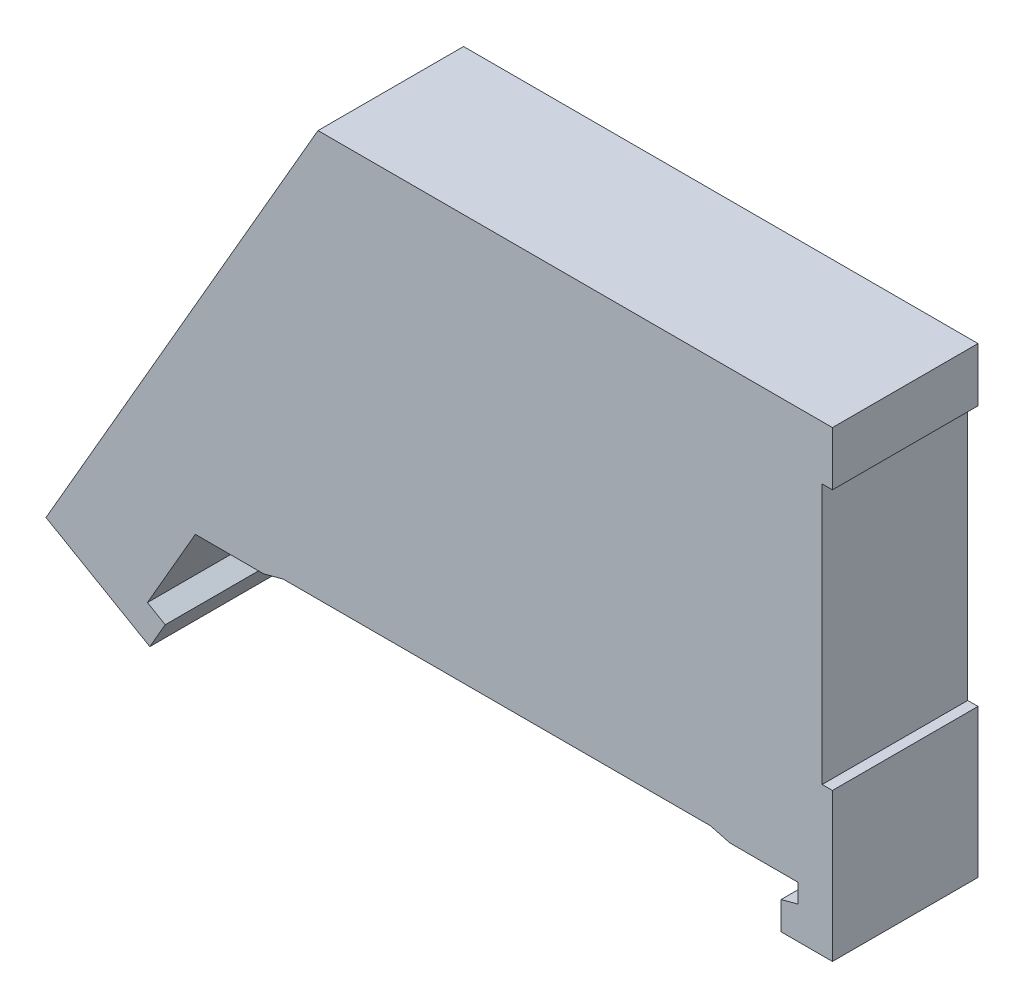
ISO-10303-21;
HEADER;
FILE_DESCRIPTION(('STEP AP214'),'2;1');
FILE_NAME('part.step','',(''),(''),'','','');
FILE_SCHEMA(('AUTOMOTIVE_DESIGN { 1 0 10303 214 1 1 1 1 }'));
ENDSEC;
DATA;
#1=APPLICATION_CONTEXT('core data for automotive mechanical design processes');
#2=APPLICATION_PROTOCOL_DEFINITION('international standard','automotive_design',2000,#1);
#3=PRODUCT_CONTEXT('',#1,'mechanical');
#4=PRODUCT('Part','Part','',(#3));
#5=PRODUCT_RELATED_PRODUCT_CATEGORY('part','',(#4));
#6=PRODUCT_DEFINITION_FORMATION('','',#4);
#7=PRODUCT_DEFINITION_CONTEXT('part definition',#1,'design');
#8=PRODUCT_DEFINITION('design','',#6,#7);
#9=PRODUCT_DEFINITION_SHAPE('','',#8);
#10=(LENGTH_UNIT() NAMED_UNIT(*) SI_UNIT(.MILLI.,.METRE.));
#11=(NAMED_UNIT(*) PLANE_ANGLE_UNIT() SI_UNIT($,.RADIAN.));
#12=(NAMED_UNIT(*) SI_UNIT($,.STERADIAN.) SOLID_ANGLE_UNIT());
#13=UNCERTAINTY_MEASURE_WITH_UNIT(LENGTH_MEASURE(1.E-05),#10,'distance_accuracy_value','');
#14=(GEOMETRIC_REPRESENTATION_CONTEXT(3) GLOBAL_UNCERTAINTY_ASSIGNED_CONTEXT((#13)) GLOBAL_UNIT_ASSIGNED_CONTEXT((#10,
#11,#12)) REPRESENTATION_CONTEXT('',''));
#15=CARTESIAN_POINT('',(0.,0.,0.));
#16=DIRECTION('',(0.,0.,1.));
#17=DIRECTION('',(1.,0.,0.));
#18=AXIS2_PLACEMENT_3D('',#15,#16,#17);
#19=CARTESIAN_POINT('',(9.19999999999996,0.,8.5));
#20=DIRECTION('',(-0.258819045102745,-0.965925826289008,0.));
#21=DIRECTION('',(0.965925826289008,-0.258819045102745,0.));
#22=AXIS2_PLACEMENT_3D('',#19,#20,#21);
#23=PLANE('',#22);
#24=DIRECTION('',(-0.965925826289008,0.258819045102745,0.));
#25=VECTOR('',#24,1.);
#26=CARTESIAN_POINT('',(9.19999999999996,0.,0.));
#27=LINE('',#26,#25);
#28=CARTESIAN_POINT('',(9.19999999999996,0.,0.));
#29=VERTEX_POINT('',#28);
#30=CARTESIAN_POINT('',(8.08038475772999,0.300000000000001,0.));
#31=VERTEX_POINT('',#30);
#32=EDGE_CURVE('E201',#29,#31,#27,.T.);
#33=ORIENTED_EDGE('',*,*,#32,.F.);
#34=DIRECTION('',(0.,0.,-1.));
#35=VECTOR('',#34,1.);
#36=CARTESIAN_POINT('',(9.19999999999996,0.,8.5));
#37=LINE('',#36,#35);
#38=CARTESIAN_POINT('',(9.19999999999996,0.,8.5));
#39=VERTEX_POINT('',#38);
#40=EDGE_CURVE('E11',#39,#29,#37,.T.);
#41=ORIENTED_EDGE('',*,*,#40,.F.);
#42=DIRECTION('',(-0.965925826289008,0.258819045102745,0.));
#43=VECTOR('',#42,1.);
#44=CARTESIAN_POINT('',(9.19999999999996,0.,8.5));
#45=LINE('',#44,#43);
#46=CARTESIAN_POINT('',(8.08038475772999,0.300000000000001,8.5));
#47=VERTEX_POINT('',#46);
#48=EDGE_CURVE('E257',#39,#47,#45,.T.);
#49=ORIENTED_EDGE('',*,*,#48,.T.);
#50=DIRECTION('',(0.,0.,-1.));
#51=VECTOR('',#50,1.);
#52=CARTESIAN_POINT('',(8.08038475772999,0.300000000000001,8.5));
#53=LINE('',#52,#51);
#54=EDGE_CURVE('E35',#47,#31,#53,.T.);
#55=ORIENTED_EDGE('',*,*,#54,.T.);
#56=EDGE_LOOP('',(#33,#41,#49,#55));
#57=FACE_BOUND('',#56,.T.);
#58=ADVANCED_FACE('F32',(#57),#23,.T.);
#59=CARTESIAN_POINT('',(13.2,0.,8.5));
#60=DIRECTION('',(0.,-1.,0.));
#61=DIRECTION('',(1.,0.,0.));
#62=AXIS2_PLACEMENT_3D('',#59,#60,#61);
#63=PLANE('',#62);
#64=DIRECTION('',(-1.,0.,0.));
#65=VECTOR('',#64,1.);
#66=CARTESIAN_POINT('',(13.2,0.,0.));
#67=LINE('',#66,#65);
#68=CARTESIAN_POINT('',(13.2,0.,0.));
#69=VERTEX_POINT('',#68);
#70=EDGE_CURVE('E255',#69,#29,#67,.T.);
#71=ORIENTED_EDGE('',*,*,#70,.F.);
#72=DIRECTION('',(0.,0.,-1.));
#73=VECTOR('',#72,1.);
#74=CARTESIAN_POINT('',(13.2,0.,8.5));
#75=LINE('',#74,#73);
#76=CARTESIAN_POINT('',(13.2,0.,8.5));
#77=VERTEX_POINT('',#76);
#78=EDGE_CURVE('E41',#77,#69,#75,.T.);
#79=ORIENTED_EDGE('',*,*,#78,.F.);
#80=DIRECTION('',(-1.,0.,0.));
#81=VECTOR('',#80,1.);
#82=CARTESIAN_POINT('',(13.2,0.,8.5));
#83=LINE('',#82,#81);
#84=EDGE_CURVE('E191',#77,#39,#83,.T.);
#85=ORIENTED_EDGE('',*,*,#84,.T.);
#86=ORIENTED_EDGE('',*,*,#40,.T.);
#87=EDGE_LOOP('',(#71,#79,#85,#86));
#88=FACE_BOUND('',#87,.T.);
#89=ADVANCED_FACE('F293',(#88),#63,.T.);
#90=CARTESIAN_POINT('',(13.1999999999998,-1.09999999999924,8.5));
#91=DIRECTION('',(-1.,1.86088518332187E-13,0.));
#92=DIRECTION('',(-1.86088518332187E-13,-1.,0.));
#93=AXIS2_PLACEMENT_3D('',#90,#91,#92);
#94=PLANE('',#93);
#95=DIRECTION('',(1.86088518332187E-13,1.,0.));
#96=VECTOR('',#95,1.);
#97=CARTESIAN_POINT('',(13.1999999999998,-1.09999999999924,0.));
#98=LINE('',#97,#96);
#99=CARTESIAN_POINT('',(13.1999999999998,-1.09999999999924,0.));
#100=VERTEX_POINT('',#99);
#101=EDGE_CURVE('E178',#100,#69,#98,.T.);
#102=ORIENTED_EDGE('',*,*,#101,.F.);
#103=DIRECTION('',(0.,0.,-1.));
#104=VECTOR('',#103,1.);
#105=CARTESIAN_POINT('',(13.1999999999998,-1.09999999999924,8.5));
#106=LINE('',#105,#104);
#107=CARTESIAN_POINT('',(13.1999999999998,-1.09999999999924,8.5));
#108=VERTEX_POINT('',#107);
#109=EDGE_CURVE('E173',#108,#100,#106,.T.);
#110=ORIENTED_EDGE('',*,*,#109,.F.);
#111=DIRECTION('',(1.86088518332187E-13,1.,0.));
#112=VECTOR('',#111,1.);
#113=CARTESIAN_POINT('',(13.1999999999998,-1.09999999999924,8.5));
#114=LINE('',#113,#112);
#115=EDGE_CURVE('E176',#108,#77,#114,.T.);
#116=ORIENTED_EDGE('',*,*,#115,.T.);
#117=ORIENTED_EDGE('',*,*,#78,.T.);
#118=EDGE_LOOP('',(#102,#110,#116,#117));
#119=FACE_BOUND('',#118,.T.);
#120=ADVANCED_FACE('F175',(#119),#94,.T.);
#121=CARTESIAN_POINT('',(12.2,-1.36794919243,8.5));
#122=DIRECTION('',(-0.258819045102247,0.965925826289142,0.));
#123=DIRECTION('',(-0.965925826289142,-0.258819045102247,0.));
#124=AXIS2_PLACEMENT_3D('',#121,#122,#123);
#125=PLANE('',#124);
#126=DIRECTION('',(0.965925826289142,0.258819045102247,0.));
#127=VECTOR('',#126,1.);
#128=CARTESIAN_POINT('',(12.2,-1.36794919243,0.));
#129=LINE('',#128,#127);
#130=CARTESIAN_POINT('',(12.2,-1.36794919243,0.));
#131=VERTEX_POINT('',#130);
#132=EDGE_CURVE('E252',#131,#100,#129,.T.);
#133=ORIENTED_EDGE('',*,*,#132,.F.);
#134=DIRECTION('',(0.,0.,-1.));
#135=VECTOR('',#134,1.);
#136=CARTESIAN_POINT('',(12.2,-1.36794919243,8.5));
#137=LINE('',#136,#135);
#138=CARTESIAN_POINT('',(12.2,-1.36794919243,8.5));
#139=VERTEX_POINT('',#138);
#140=EDGE_CURVE('E183',#139,#131,#137,.T.);
#141=ORIENTED_EDGE('',*,*,#140,.F.);
#142=DIRECTION('',(0.965925826289142,0.258819045102247,0.));
#143=VECTOR('',#142,1.);
#144=CARTESIAN_POINT('',(12.2,-1.36794919243,8.5));
#145=LINE('',#144,#143);
#146=EDGE_CURVE('E189',#139,#108,#145,.T.);
#147=ORIENTED_EDGE('',*,*,#146,.T.);
#148=ORIENTED_EDGE('',*,*,#109,.T.);
#149=EDGE_LOOP('',(#133,#141,#147,#148));
#150=FACE_BOUND('',#149,.T.);
#151=ADVANCED_FACE('F193',(#150),#125,.T.);
#152=CARTESIAN_POINT('',(12.2,-3.,8.5));
#153=DIRECTION('',(-1.,0.,0.));
#154=DIRECTION('',(0.,0.,1.));
#155=AXIS2_PLACEMENT_3D('',#152,#153,#154);
#156=PLANE('',#155);
#157=DIRECTION('',(0.,1.,0.));
#158=VECTOR('',#157,1.);
#159=CARTESIAN_POINT('',(12.2,-3.,0.));
#160=LINE('',#159,#158);
#161=CARTESIAN_POINT('',(12.2,-3.,0.));
#162=VERTEX_POINT('',#161);
#163=EDGE_CURVE('E249',#162,#131,#160,.T.);
#164=ORIENTED_EDGE('',*,*,#163,.F.);
#165=DIRECTION('',(0.,0.,-1.));
#166=VECTOR('',#165,1.);
#167=CARTESIAN_POINT('',(12.2,-3.,8.5));
#168=LINE('',#167,#166);
#169=CARTESIAN_POINT('',(12.2,-3.,8.5));
#170=VERTEX_POINT('',#169);
#171=EDGE_CURVE('E261',#170,#162,#168,.T.);
#172=ORIENTED_EDGE('',*,*,#171,.F.);
#173=DIRECTION('',(0.,1.,0.));
#174=VECTOR('',#173,1.);
#175=CARTESIAN_POINT('',(12.2,-3.,8.5));
#176=LINE('',#175,#174);
#177=EDGE_CURVE('E194',#170,#139,#176,.T.);
#178=ORIENTED_EDGE('',*,*,#177,.T.);
#179=ORIENTED_EDGE('',*,*,#140,.T.);
#180=EDGE_LOOP('',(#164,#172,#178,#179));
#181=FACE_BOUND('',#180,.T.);
#182=ADVANCED_FACE('F306',(#181),#156,.T.);
#183=CARTESIAN_POINT('',(15.2,-3.,8.5));
#184=DIRECTION('',(0.,-1.,0.));
#185=DIRECTION('',(0.,0.,-1.));
#186=AXIS2_PLACEMENT_3D('',#183,#184,#185);
#187=PLANE('',#186);
#188=DIRECTION('',(-1.,0.,0.));
#189=VECTOR('',#188,1.);
#190=CARTESIAN_POINT('',(15.2,-3.,0.));
#191=LINE('',#190,#189);
#192=CARTESIAN_POINT('',(15.2,-3.,0.));
#193=VERTEX_POINT('',#192);
#194=EDGE_CURVE('E246',#193,#162,#191,.T.);
#195=ORIENTED_EDGE('',*,*,#194,.F.);
#196=DIRECTION('',(0.,0.,-1.));
#197=VECTOR('',#196,1.);
#198=CARTESIAN_POINT('',(15.2,-3.,8.5));
#199=LINE('',#198,#197);
#200=CARTESIAN_POINT('',(15.2,-3.,8.5));
#201=VERTEX_POINT('',#200);
#202=EDGE_CURVE('E263',#201,#193,#199,.T.);
#203=ORIENTED_EDGE('',*,*,#202,.F.);
#204=DIRECTION('',(-1.,0.,0.));
#205=VECTOR('',#204,1.);
#206=CARTESIAN_POINT('',(15.2,-3.,8.5));
#207=LINE('',#206,#205);
#208=EDGE_CURVE('E196',#201,#170,#207,.T.);
#209=ORIENTED_EDGE('',*,*,#208,.T.);
#210=ORIENTED_EDGE('',*,*,#171,.T.);
#211=EDGE_LOOP('',(#195,#203,#209,#210));
#212=FACE_BOUND('',#211,.T.);
#213=ADVANCED_FACE('F309',(#212),#187,.T.);
#214=CARTESIAN_POINT('',(15.2,5.65,8.5));
#215=DIRECTION('',(1.,0.,0.));
#216=DIRECTION('',(0.,0.,-1.));
#217=AXIS2_PLACEMENT_3D('',#214,#215,#216);
#218=PLANE('',#217);
#219=DIRECTION('',(0.,-1.,0.));
#220=VECTOR('',#219,1.);
#221=CARTESIAN_POINT('',(15.2,5.65,0.));
#222=LINE('',#221,#220);
#223=CARTESIAN_POINT('',(15.2,5.65,0.));
#224=VERTEX_POINT('',#223);
#225=EDGE_CURVE('E243',#224,#193,#222,.T.);
#226=ORIENTED_EDGE('',*,*,#225,.F.);
#227=DIRECTION('',(0.,0.,-1.));
#228=VECTOR('',#227,1.);
#229=CARTESIAN_POINT('',(15.2,5.65,8.5));
#230=LINE('',#229,#228);
#231=CARTESIAN_POINT('',(15.2,5.65,8.5));
#232=VERTEX_POINT('',#231);
#233=EDGE_CURVE('E265',#232,#224,#230,.T.);
#234=ORIENTED_EDGE('',*,*,#233,.F.);
#235=DIRECTION('',(0.,-1.,0.));
#236=VECTOR('',#235,1.);
#237=CARTESIAN_POINT('',(15.2,5.65,8.5));
#238=LINE('',#237,#236);
#239=EDGE_CURVE('E548',#232,#201,#238,.T.);
#240=ORIENTED_EDGE('',*,*,#239,.T.);
#241=ORIENTED_EDGE('',*,*,#202,.T.);
#242=EDGE_LOOP('',(#226,#234,#240,#241));
#243=FACE_BOUND('',#242,.T.);
#244=ADVANCED_FACE('F313',(#243),#218,.T.);
#245=CARTESIAN_POINT('',(14.6,5.65,8.5));
#246=DIRECTION('',(0.,1.,0.));
#247=DIRECTION('',(0.,0.,1.));
#248=AXIS2_PLACEMENT_3D('',#245,#246,#247);
#249=PLANE('',#248);
#250=DIRECTION('',(1.,0.,0.));
#251=VECTOR('',#250,1.);
#252=CARTESIAN_POINT('',(14.6,5.65,0.));
#253=LINE('',#252,#251);
#254=CARTESIAN_POINT('',(14.6,5.65,0.));
#255=VERTEX_POINT('',#254);
#256=EDGE_CURVE('E240',#255,#224,#253,.T.);
#257=ORIENTED_EDGE('',*,*,#256,.F.);
#258=DIRECTION('',(0.,0.,-1.));
#259=VECTOR('',#258,1.);
#260=CARTESIAN_POINT('',(14.6,5.65,8.5));
#261=LINE('',#260,#259);
#262=CARTESIAN_POINT('',(14.6,5.65,8.5));
#263=VERTEX_POINT('',#262);
#264=EDGE_CURVE('E267',#263,#255,#261,.T.);
#265=ORIENTED_EDGE('',*,*,#264,.F.);
#266=DIRECTION('',(1.,0.,0.));
#267=VECTOR('',#266,1.);
#268=CARTESIAN_POINT('',(14.6,5.65,8.5));
#269=LINE('',#268,#267);
#270=EDGE_CURVE('E541',#263,#232,#269,.T.);
#271=ORIENTED_EDGE('',*,*,#270,.T.);
#272=ORIENTED_EDGE('',*,*,#233,.T.);
#273=EDGE_LOOP('',(#257,#265,#271,#272));
#274=FACE_BOUND('',#273,.T.);
#275=ADVANCED_FACE('F317',(#274),#249,.T.);
#276=CARTESIAN_POINT('',(14.6,20.85,8.5));
#277=DIRECTION('',(1.,0.,0.));
#278=DIRECTION('',(0.,0.,-1.));
#279=AXIS2_PLACEMENT_3D('',#276,#277,#278);
#280=PLANE('',#279);
#281=DIRECTION('',(0.,-1.,0.));
#282=VECTOR('',#281,1.);
#283=CARTESIAN_POINT('',(14.6,20.85,0.));
#284=LINE('',#283,#282);
#285=CARTESIAN_POINT('',(14.6,20.85,0.));
#286=VERTEX_POINT('',#285);
#287=EDGE_CURVE('E237',#286,#255,#284,.T.);
#288=ORIENTED_EDGE('',*,*,#287,.F.);
#289=DIRECTION('',(0.,0.,-1.));
#290=VECTOR('',#289,1.);
#291=CARTESIAN_POINT('',(14.6,20.85,8.5));
#292=LINE('',#291,#290);
#293=CARTESIAN_POINT('',(14.6,20.85,8.5));
#294=VERTEX_POINT('',#293);
#295=EDGE_CURVE('E269',#294,#286,#292,.T.);
#296=ORIENTED_EDGE('',*,*,#295,.F.);
#297=DIRECTION('',(0.,-1.,0.));
#298=VECTOR('',#297,1.);
#299=CARTESIAN_POINT('',(14.6,20.85,8.5));
#300=LINE('',#299,#298);
#301=EDGE_CURVE('E537',#294,#263,#300,.T.);
#302=ORIENTED_EDGE('',*,*,#301,.T.);
#303=ORIENTED_EDGE('',*,*,#264,.T.);
#304=EDGE_LOOP('',(#288,#296,#302,#303));
#305=FACE_BOUND('',#304,.T.);
#306=ADVANCED_FACE('F321',(#305),#280,.T.);
#307=CARTESIAN_POINT('',(15.2,20.85,8.5));
#308=DIRECTION('',(0.,-1.,0.));
#309=DIRECTION('',(0.,0.,-1.));
#310=AXIS2_PLACEMENT_3D('',#307,#308,#309);
#311=PLANE('',#310);
#312=DIRECTION('',(-1.,0.,0.));
#313=VECTOR('',#312,1.);
#314=CARTESIAN_POINT('',(15.2,20.85,0.));
#315=LINE('',#314,#313);
#316=CARTESIAN_POINT('',(15.2,20.85,0.));
#317=VERTEX_POINT('',#316);
#318=EDGE_CURVE('E234',#317,#286,#315,.T.);
#319=ORIENTED_EDGE('',*,*,#318,.F.);
#320=DIRECTION('',(0.,0.,-1.));
#321=VECTOR('',#320,1.);
#322=CARTESIAN_POINT('',(15.2,20.85,8.5));
#323=LINE('',#322,#321);
#324=CARTESIAN_POINT('',(15.2,20.85,8.5));
#325=VERTEX_POINT('',#324);
#326=EDGE_CURVE('E271',#325,#317,#323,.T.);
#327=ORIENTED_EDGE('',*,*,#326,.F.);
#328=DIRECTION('',(-1.,0.,0.));
#329=VECTOR('',#328,1.);
#330=CARTESIAN_POINT('',(15.2,20.85,8.5));
#331=LINE('',#330,#329);
#332=EDGE_CURVE('E553',#325,#294,#331,.T.);
#333=ORIENTED_EDGE('',*,*,#332,.T.);
#334=ORIENTED_EDGE('',*,*,#295,.T.);
#335=EDGE_LOOP('',(#319,#327,#333,#334));
#336=FACE_BOUND('',#335,.T.);
#337=ADVANCED_FACE('F325',(#336),#311,.T.);
#338=CARTESIAN_POINT('',(15.2,24.,8.5));
#339=DIRECTION('',(1.,0.,0.));
#340=DIRECTION('',(0.,0.,-1.));
#341=AXIS2_PLACEMENT_3D('',#338,#339,#340);
#342=PLANE('',#341);
#343=DIRECTION('',(0.,-1.,0.));
#344=VECTOR('',#343,1.);
#345=CARTESIAN_POINT('',(15.2,24.,0.));
#346=LINE('',#345,#344);
#347=CARTESIAN_POINT('',(15.2,24.,0.));
#348=VERTEX_POINT('',#347);
#349=EDGE_CURVE('E231',#348,#317,#346,.T.);
#350=ORIENTED_EDGE('',*,*,#349,.F.);
#351=DIRECTION('',(0.,0.,-1.));
#352=VECTOR('',#351,1.);
#353=CARTESIAN_POINT('',(15.2,24.,8.5));
#354=LINE('',#353,#352);
#355=CARTESIAN_POINT('',(15.2,24.,8.5));
#356=VERTEX_POINT('',#355);
#357=EDGE_CURVE('E273',#356,#348,#354,.T.);
#358=ORIENTED_EDGE('',*,*,#357,.F.);
#359=DIRECTION('',(0.,-1.,0.));
#360=VECTOR('',#359,1.);
#361=CARTESIAN_POINT('',(15.2,24.,8.5));
#362=LINE('',#361,#360);
#363=EDGE_CURVE('E530',#356,#325,#362,.T.);
#364=ORIENTED_EDGE('',*,*,#363,.T.);
#365=ORIENTED_EDGE('',*,*,#326,.T.);
#366=EDGE_LOOP('',(#350,#358,#364,#365));
#367=FACE_BOUND('',#366,.T.);
#368=ADVANCED_FACE('F329',(#367),#342,.T.);
#369=CARTESIAN_POINT('',(-14.8397459621683,24.,8.5));
#370=DIRECTION('',(0.,1.,0.));
#371=DIRECTION('',(-1.,0.,0.));
#372=AXIS2_PLACEMENT_3D('',#369,#370,#371);
#373=PLANE('',#372);
#374=DIRECTION('',(1.,0.,0.));
#375=VECTOR('',#374,1.);
#376=CARTESIAN_POINT('',(-14.8397459621683,24.,0.));
#377=LINE('',#376,#375);
#378=CARTESIAN_POINT('',(-14.8397459621683,24.,0.));
#379=VERTEX_POINT('',#378);
#380=EDGE_CURVE('E228',#379,#348,#377,.T.);
#381=ORIENTED_EDGE('',*,*,#380,.F.);
#382=DIRECTION('',(0.,0.,-1.));
#383=VECTOR('',#382,1.);
#384=CARTESIAN_POINT('',(-14.8397459621683,24.,8.5));
#385=LINE('',#384,#383);
#386=CARTESIAN_POINT('',(-14.8397459621683,24.,8.5));
#387=VERTEX_POINT('',#386);
#388=EDGE_CURVE('E275',#387,#379,#385,.T.);
#389=ORIENTED_EDGE('',*,*,#388,.F.);
#390=DIRECTION('',(1.,0.,0.));
#391=VECTOR('',#390,1.);
#392=CARTESIAN_POINT('',(-14.8397459621683,24.,8.5));
#393=LINE('',#392,#391);
#394=EDGE_CURVE('E526',#387,#356,#393,.T.);
#395=ORIENTED_EDGE('',*,*,#394,.T.);
#396=ORIENTED_EDGE('',*,*,#357,.T.);
#397=EDGE_LOOP('',(#381,#389,#395,#396));
#398=FACE_BOUND('',#397,.T.);
#399=ADVANCED_FACE('F333',(#398),#373,.T.);
#400=CARTESIAN_POINT('',(-30.7221143170399,-3.50906893516158,8.5));
#401=DIRECTION('',(-0.866025403784438,0.500000000000001,0.));
#402=DIRECTION('',(-0.500000000000001,-0.866025403784438,0.));
#403=AXIS2_PLACEMENT_3D('',#400,#401,#402);
#404=PLANE('',#403);
#405=DIRECTION('',(0.500000000000001,0.866025403784438,0.));
#406=VECTOR('',#405,1.);
#407=CARTESIAN_POINT('',(-30.7221143170399,-3.50906893516158,0.));
#408=LINE('',#407,#406);
#409=CARTESIAN_POINT('',(-30.7221143170399,-3.50906893516158,0.));
#410=VERTEX_POINT('',#409);
#411=EDGE_CURVE('E225',#410,#379,#408,.T.);
#412=ORIENTED_EDGE('',*,*,#411,.F.);
#413=DIRECTION('',(0.,0.,-1.));
#414=VECTOR('',#413,1.);
#415=CARTESIAN_POINT('',(-30.7221143170399,-3.50906893516158,8.5));
#416=LINE('',#415,#414);
#417=CARTESIAN_POINT('',(-30.7221143170399,-3.50906893516158,8.5));
#418=VERTEX_POINT('',#417);
#419=EDGE_CURVE('E277',#418,#410,#416,.T.);
#420=ORIENTED_EDGE('',*,*,#419,.F.);
#421=DIRECTION('',(0.500000000000001,0.866025403784438,0.));
#422=VECTOR('',#421,1.);
#423=CARTESIAN_POINT('',(-30.7221143170399,-3.50906893516158,8.5));
#424=LINE('',#423,#422);
#425=EDGE_CURVE('E557',#418,#387,#424,.T.);
#426=ORIENTED_EDGE('',*,*,#425,.T.);
#427=ORIENTED_EDGE('',*,*,#388,.T.);
#428=EDGE_LOOP('',(#412,#420,#426,#427));
#429=FACE_BOUND('',#428,.T.);
#430=ADVANCED_FACE('F337',(#429),#404,.T.);
#431=CARTESIAN_POINT('',(-24.6599364905099,-7.00906893518406,8.5));
#432=DIRECTION('',(-0.5,-0.866025403784439,0.));
#433=DIRECTION('',(0.866025403784439,-0.5,0.));
#434=AXIS2_PLACEMENT_3D('',#431,#432,#433);
#435=PLANE('',#434);
#436=DIRECTION('',(-0.866025403784439,0.5,0.));
#437=VECTOR('',#436,1.);
#438=CARTESIAN_POINT('',(-24.6599364905099,-7.00906893518406,0.));
#439=LINE('',#438,#437);
#440=CARTESIAN_POINT('',(-24.6599364905099,-7.00906893518406,0.));
#441=VERTEX_POINT('',#440);
#442=EDGE_CURVE('E222',#441,#410,#439,.T.);
#443=ORIENTED_EDGE('',*,*,#442,.F.);
#444=DIRECTION('',(0.,0.,-1.));
#445=VECTOR('',#444,1.);
#446=CARTESIAN_POINT('',(-24.6599364905099,-7.00906893518406,8.5));
#447=LINE('',#446,#445);
#448=CARTESIAN_POINT('',(-24.6599364905099,-7.00906893518406,8.5));
#449=VERTEX_POINT('',#448);
#450=EDGE_CURVE('E279',#449,#441,#447,.T.);
#451=ORIENTED_EDGE('',*,*,#450,.F.);
#452=DIRECTION('',(-0.866025403784439,0.5,0.));
#453=VECTOR('',#452,1.);
#454=CARTESIAN_POINT('',(-24.6599364905099,-7.00906893518406,8.5));
#455=LINE('',#454,#453);
#456=EDGE_CURVE('E519',#449,#418,#455,.T.);
#457=ORIENTED_EDGE('',*,*,#456,.T.);
#458=ORIENTED_EDGE('',*,*,#419,.T.);
#459=EDGE_LOOP('',(#443,#451,#457,#458));
#460=FACE_BOUND('',#459,.T.);
#461=ADVANCED_FACE('F341',(#460),#435,.T.);
#462=CARTESIAN_POINT('',(-23.7599364905083,-5.45022320836935,8.5));
#463=DIRECTION('',(0.866025403784439,-0.5,0.));
#464=DIRECTION('',(0.5,0.866025403784439,0.));
#465=AXIS2_PLACEMENT_3D('',#462,#463,#464);
#466=PLANE('',#465);
#467=DIRECTION('',(-0.5,-0.866025403784439,0.));
#468=VECTOR('',#467,1.);
#469=CARTESIAN_POINT('',(-23.7599364905083,-5.45022320836935,0.));
#470=LINE('',#469,#468);
#471=CARTESIAN_POINT('',(-23.7599364905083,-5.45022320836935,0.));
#472=VERTEX_POINT('',#471);
#473=EDGE_CURVE('E219',#472,#441,#470,.T.);
#474=ORIENTED_EDGE('',*,*,#473,.F.);
#475=DIRECTION('',(0.,0.,-1.));
#476=VECTOR('',#475,1.);
#477=CARTESIAN_POINT('',(-23.7599364905083,-5.45022320836935,8.5));
#478=LINE('',#477,#476);
#479=CARTESIAN_POINT('',(-23.7599364905083,-5.45022320836935,8.5));
#480=VERTEX_POINT('',#479);
#481=EDGE_CURVE('E281',#480,#472,#478,.T.);
#482=ORIENTED_EDGE('',*,*,#481,.F.);
#483=DIRECTION('',(-0.5,-0.866025403784439,0.));
#484=VECTOR('',#483,1.);
#485=CARTESIAN_POINT('',(-23.7599364905083,-5.45022320836935,8.5));
#486=LINE('',#485,#484);
#487=EDGE_CURVE('E515',#480,#449,#486,.T.);
#488=ORIENTED_EDGE('',*,*,#487,.T.);
#489=ORIENTED_EDGE('',*,*,#450,.T.);
#490=EDGE_LOOP('',(#474,#482,#488,#489));
#491=FACE_BOUND('',#490,.T.);
#492=ADVANCED_FACE('F345',(#491),#466,.T.);
#493=CARTESIAN_POINT('',(-24.7999999999988,-4.8497422611907,8.5));
#494=DIRECTION('',(0.499999999999999,0.866025403784439,0.));
#495=DIRECTION('',(-0.866025403784439,0.499999999999999,0.));
#496=AXIS2_PLACEMENT_3D('',#493,#494,#495);
#497=PLANE('',#496);
#498=DIRECTION('',(0.866025403784439,-0.499999999999999,0.));
#499=VECTOR('',#498,1.);
#500=CARTESIAN_POINT('',(-24.7999999999988,-4.8497422611907,0.));
#501=LINE('',#500,#499);
#502=CARTESIAN_POINT('',(-24.7999999999988,-4.8497422611907,0.));
#503=VERTEX_POINT('',#502);
#504=EDGE_CURVE('E216',#503,#472,#501,.T.);
#505=ORIENTED_EDGE('',*,*,#504,.F.);
#506=DIRECTION('',(0.,0.,-1.));
#507=VECTOR('',#506,1.);
#508=CARTESIAN_POINT('',(-24.7999999999988,-4.8497422611907,8.5));
#509=LINE('',#508,#507);
#510=CARTESIAN_POINT('',(-24.7999999999988,-4.8497422611907,8.5));
#511=VERTEX_POINT('',#510);
#512=EDGE_CURVE('E283',#511,#503,#509,.T.);
#513=ORIENTED_EDGE('',*,*,#512,.F.);
#514=DIRECTION('',(0.866025403784439,-0.499999999999999,0.));
#515=VECTOR('',#514,1.);
#516=CARTESIAN_POINT('',(-24.7999999999988,-4.8497422611907,8.5));
#517=LINE('',#516,#515);
#518=EDGE_CURVE('E561',#511,#480,#517,.T.);
#519=ORIENTED_EDGE('',*,*,#518,.T.);
#520=ORIENTED_EDGE('',*,*,#481,.T.);
#521=EDGE_LOOP('',(#505,#513,#519,#520));
#522=FACE_BOUND('',#521,.T.);
#523=ADVANCED_FACE('F349',(#522),#497,.T.);
#524=CARTESIAN_POINT('',(-22.,0.,8.5));
#525=DIRECTION('',(0.86602540378444,-0.499999999999998,0.));
#526=DIRECTION('',(0.499999999999998,0.86602540378444,0.));
#527=AXIS2_PLACEMENT_3D('',#524,#525,#526);
#528=PLANE('',#527);
#529=DIRECTION('',(-0.499999999999998,-0.86602540378444,0.));
#530=VECTOR('',#529,1.);
#531=CARTESIAN_POINT('',(-22.,0.,0.));
#532=LINE('',#531,#530);
#533=CARTESIAN_POINT('',(-22.,0.,0.));
#534=VERTEX_POINT('',#533);
#535=EDGE_CURVE('E213',#534,#503,#532,.T.);
#536=ORIENTED_EDGE('',*,*,#535,.F.);
#537=DIRECTION('',(0.,0.,-1.));
#538=VECTOR('',#537,1.);
#539=CARTESIAN_POINT('',(-22.,0.,8.5));
#540=LINE('',#539,#538);
#541=CARTESIAN_POINT('',(-22.,0.,8.5));
#542=VERTEX_POINT('',#541);
#543=EDGE_CURVE('E285',#542,#534,#540,.T.);
#544=ORIENTED_EDGE('',*,*,#543,.F.);
#545=DIRECTION('',(-0.499999999999998,-0.86602540378444,0.));
#546=VECTOR('',#545,1.);
#547=CARTESIAN_POINT('',(-22.,0.,8.5));
#548=LINE('',#547,#546);
#549=EDGE_CURVE('E508',#542,#511,#548,.T.);
#550=ORIENTED_EDGE('',*,*,#549,.T.);
#551=ORIENTED_EDGE('',*,*,#512,.T.);
#552=EDGE_LOOP('',(#536,#544,#550,#551));
#553=FACE_BOUND('',#552,.T.);
#554=ADVANCED_FACE('F353',(#553),#528,.T.);
#555=CARTESIAN_POINT('',(-18.,0.,8.5));
#556=DIRECTION('',(0.,-1.,0.));
#557=DIRECTION('',(1.,0.,0.));
#558=AXIS2_PLACEMENT_3D('',#555,#556,#557);
#559=PLANE('',#558);
#560=DIRECTION('',(-1.,0.,0.));
#561=VECTOR('',#560,1.);
#562=CARTESIAN_POINT('',(-18.,0.,0.));
#563=LINE('',#562,#561);
#564=CARTESIAN_POINT('',(-18.,0.,0.));
#565=VERTEX_POINT('',#564);
#566=EDGE_CURVE('E210',#565,#534,#563,.T.);
#567=ORIENTED_EDGE('',*,*,#566,.F.);
#568=DIRECTION('',(0.,0.,-1.));
#569=VECTOR('',#568,1.);
#570=CARTESIAN_POINT('',(-18.,0.,8.5));
#571=LINE('',#570,#569);
#572=CARTESIAN_POINT('',(-18.,0.,8.5));
#573=VERTEX_POINT('',#572);
#574=EDGE_CURVE('E287',#573,#565,#571,.T.);
#575=ORIENTED_EDGE('',*,*,#574,.F.);
#576=DIRECTION('',(-1.,0.,0.));
#577=VECTOR('',#576,1.);
#578=CARTESIAN_POINT('',(-18.,0.,8.5));
#579=LINE('',#578,#577);
#580=EDGE_CURVE('E504',#573,#542,#579,.T.);
#581=ORIENTED_EDGE('',*,*,#580,.T.);
#582=ORIENTED_EDGE('',*,*,#543,.T.);
#583=EDGE_LOOP('',(#567,#575,#581,#582));
#584=FACE_BOUND('',#583,.T.);
#585=ADVANCED_FACE('F357',(#584),#559,.T.);
#586=CARTESIAN_POINT('',(-16.8803847577006,0.300000000000086,8.5));
#587=DIRECTION('',(0.258819045096379,-0.965925826290714,0.));
#588=DIRECTION('',(0.965925826290714,0.258819045096379,0.));
#589=AXIS2_PLACEMENT_3D('',#586,#587,#588);
#590=PLANE('',#589);
#591=DIRECTION('',(-0.965925826290714,-0.258819045096379,0.));
#592=VECTOR('',#591,1.);
#593=CARTESIAN_POINT('',(-16.8803847577006,0.300000000000086,0.));
#594=LINE('',#593,#592);
#595=CARTESIAN_POINT('',(-16.8803847577006,0.300000000000086,0.));
#596=VERTEX_POINT('',#595);
#597=EDGE_CURVE('E207',#596,#565,#594,.T.);
#598=ORIENTED_EDGE('',*,*,#597,.F.);
#599=DIRECTION('',(0.,0.,-1.));
#600=VECTOR('',#599,1.);
#601=CARTESIAN_POINT('',(-16.8803847577006,0.300000000000086,8.5));
#602=LINE('',#601,#600);
#603=CARTESIAN_POINT('',(-16.8803847577006,0.300000000000086,8.5));
#604=VERTEX_POINT('',#603);
#605=EDGE_CURVE('E288',#604,#596,#602,.T.);
#606=ORIENTED_EDGE('',*,*,#605,.F.);
#607=DIRECTION('',(-0.965925826290714,-0.258819045096379,0.));
#608=VECTOR('',#607,1.);
#609=CARTESIAN_POINT('',(-16.8803847577006,0.300000000000086,8.5));
#610=LINE('',#609,#608);
#611=EDGE_CURVE('E565',#604,#573,#610,.T.);
#612=ORIENTED_EDGE('',*,*,#611,.T.);
#613=ORIENTED_EDGE('',*,*,#574,.T.);
#614=EDGE_LOOP('',(#598,#606,#612,#613));
#615=FACE_BOUND('',#614,.T.);
#616=ADVANCED_FACE('F361',(#615),#590,.T.);
#617=CARTESIAN_POINT('',(8.08038475772999,0.300000000000001,8.5));
#618=DIRECTION('',(0.,-1.,0.));
#619=DIRECTION('',(1.,0.,0.));
#620=AXIS2_PLACEMENT_3D('',#617,#618,#619);
#621=PLANE('',#620);
#622=DIRECTION('',(-1.,0.,0.));
#623=VECTOR('',#622,1.);
#624=CARTESIAN_POINT('',(8.08038475772999,0.300000000000001,0.));
#625=LINE('',#624,#623);
#626=EDGE_CURVE('E204',#31,#596,#625,.T.);
#627=ORIENTED_EDGE('',*,*,#626,.F.);
#628=ORIENTED_EDGE('',*,*,#54,.F.);
#629=DIRECTION('',(-1.,0.,0.));
#630=VECTOR('',#629,1.);
#631=CARTESIAN_POINT('',(8.08038475772999,0.300000000000001,8.5));
#632=LINE('',#631,#630);
#633=EDGE_CURVE('E567',#47,#604,#632,.T.);
#634=ORIENTED_EDGE('',*,*,#633,.T.);
#635=ORIENTED_EDGE('',*,*,#605,.T.);
#636=EDGE_LOOP('',(#627,#628,#634,#635));
#637=FACE_BOUND('',#636,.T.);
#638=ADVANCED_FACE('F290',(#637),#621,.T.);
#639=CARTESIAN_POINT('',(0.,0.,8.5));
#640=DIRECTION('',(0.,0.,1.));
#641=DIRECTION('',(1.,0.,0.));
#642=AXIS2_PLACEMENT_3D('',#639,#640,#641);
#643=PLANE('',#642);
#644=ORIENTED_EDGE('',*,*,#48,.F.);
#645=ORIENTED_EDGE('',*,*,#84,.F.);
#646=ORIENTED_EDGE('',*,*,#115,.F.);
#647=ORIENTED_EDGE('',*,*,#146,.F.);
#648=ORIENTED_EDGE('',*,*,#177,.F.);
#649=ORIENTED_EDGE('',*,*,#208,.F.);
#650=ORIENTED_EDGE('',*,*,#239,.F.);
#651=ORIENTED_EDGE('',*,*,#270,.F.);
#652=ORIENTED_EDGE('',*,*,#301,.F.);
#653=ORIENTED_EDGE('',*,*,#332,.F.);
#654=ORIENTED_EDGE('',*,*,#363,.F.);
#655=ORIENTED_EDGE('',*,*,#394,.F.);
#656=ORIENTED_EDGE('',*,*,#425,.F.);
#657=ORIENTED_EDGE('',*,*,#456,.F.);
#658=ORIENTED_EDGE('',*,*,#487,.F.);
#659=ORIENTED_EDGE('',*,*,#518,.F.);
#660=ORIENTED_EDGE('',*,*,#549,.F.);
#661=ORIENTED_EDGE('',*,*,#580,.F.);
#662=ORIENTED_EDGE('',*,*,#611,.F.);
#663=ORIENTED_EDGE('',*,*,#633,.F.);
#664=EDGE_LOOP('',(#644,#645,#646,#647,#648,#649,#650,#651,#652,#653,#654,#655,#656,#657,#658,
#659,#660,#661,#662,#663));
#665=FACE_BOUND('',#664,.T.);
#666=ADVANCED_FACE('F187',(#665),#643,.T.);
#667=CARTESIAN_POINT('',(0.,0.,0.));
#668=DIRECTION('',(0.,0.,1.));
#669=DIRECTION('',(1.,0.,0.));
#670=AXIS2_PLACEMENT_3D('',#667,#668,#669);
#671=PLANE('',#670);
#672=ORIENTED_EDGE('',*,*,#32,.T.);
#673=ORIENTED_EDGE('',*,*,#626,.T.);
#674=ORIENTED_EDGE('',*,*,#597,.T.);
#675=ORIENTED_EDGE('',*,*,#566,.T.);
#676=ORIENTED_EDGE('',*,*,#535,.T.);
#677=ORIENTED_EDGE('',*,*,#504,.T.);
#678=ORIENTED_EDGE('',*,*,#473,.T.);
#679=ORIENTED_EDGE('',*,*,#442,.T.);
#680=ORIENTED_EDGE('',*,*,#411,.T.);
#681=ORIENTED_EDGE('',*,*,#380,.T.);
#682=ORIENTED_EDGE('',*,*,#349,.T.);
#683=ORIENTED_EDGE('',*,*,#318,.T.);
#684=ORIENTED_EDGE('',*,*,#287,.T.);
#685=ORIENTED_EDGE('',*,*,#256,.T.);
#686=ORIENTED_EDGE('',*,*,#225,.T.);
#687=ORIENTED_EDGE('',*,*,#194,.T.);
#688=ORIENTED_EDGE('',*,*,#163,.T.);
#689=ORIENTED_EDGE('',*,*,#132,.T.);
#690=ORIENTED_EDGE('',*,*,#101,.T.);
#691=ORIENTED_EDGE('',*,*,#70,.T.);
#692=EDGE_LOOP('',(#672,#673,#674,#675,#676,#677,#678,#679,#680,#681,#682,#683,#684,#685,#686,
#687,#688,#689,#690,#691));
#693=FACE_BOUND('',#692,.T.);
#694=ADVANCED_FACE('F292',(#693),#671,.F.);
#695=CLOSED_SHELL('',(#58,#89,#120,#151,#182,#213,#244,#275,#306,#337,#368,#399,#430,#461,#492,
#523,#554,#585,#616,#638,#666,#694));
#696=MANIFOLD_SOLID_BREP('B2',#695);
#697=ADVANCED_BREP_SHAPE_REPRESENTATION('',(#18,#696),#14);
#698=SHAPE_DEFINITION_REPRESENTATION(#9,#697);
ENDSEC;
END-ISO-10303-21;
